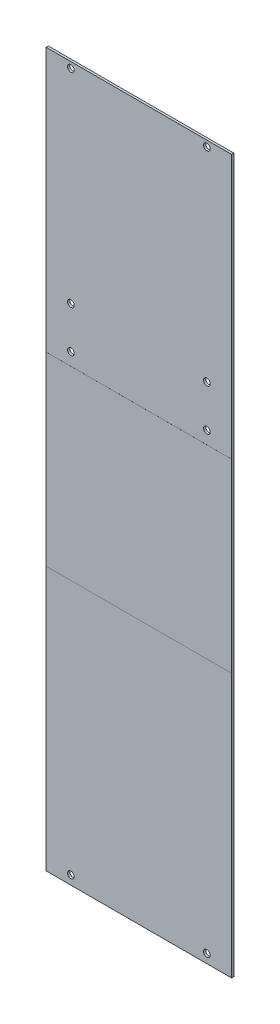
ISO-10303-21;
HEADER;
FILE_DESCRIPTION(('STEP AP214'),'2;1');
FILE_NAME('part.step','',(''),(''),'','','');
FILE_SCHEMA(('AUTOMOTIVE_DESIGN { 1 0 10303 214 1 1 1 1 }'));
ENDSEC;
DATA;
#1=APPLICATION_CONTEXT('core data for automotive mechanical design processes');
#2=APPLICATION_PROTOCOL_DEFINITION('international standard','automotive_design',2000,#1);
#3=PRODUCT_CONTEXT('',#1,'mechanical');
#4=PRODUCT('Part','Part','',(#3));
#5=PRODUCT_RELATED_PRODUCT_CATEGORY('part','',(#4));
#6=PRODUCT_DEFINITION_FORMATION('','',#4);
#7=PRODUCT_DEFINITION_CONTEXT('part definition',#1,'design');
#8=PRODUCT_DEFINITION('design','',#6,#7);
#9=PRODUCT_DEFINITION_SHAPE('','',#8);
#10=(LENGTH_UNIT() NAMED_UNIT(*) SI_UNIT(.MILLI.,.METRE.));
#11=(NAMED_UNIT(*) PLANE_ANGLE_UNIT() SI_UNIT($,.RADIAN.));
#12=(NAMED_UNIT(*) SI_UNIT($,.STERADIAN.) SOLID_ANGLE_UNIT());
#13=UNCERTAINTY_MEASURE_WITH_UNIT(LENGTH_MEASURE(1.E-05),#10,'distance_accuracy_value','');
#14=(GEOMETRIC_REPRESENTATION_CONTEXT(3) GLOBAL_UNCERTAINTY_ASSIGNED_CONTEXT((#13)) GLOBAL_UNIT_ASSIGNED_CONTEXT((#10,
#11,#12)) REPRESENTATION_CONTEXT('',''));
#15=CARTESIAN_POINT('',(0.,0.,0.));
#16=DIRECTION('',(0.,0.,1.));
#17=DIRECTION('',(1.,0.,0.));
#18=AXIS2_PLACEMENT_3D('',#15,#16,#17);
#19=CARTESIAN_POINT('',(0.,0.,1.));
#20=DIRECTION('',(0.,0.,1.));
#21=DIRECTION('',(1.,0.,0.));
#22=AXIS2_PLACEMENT_3D('',#19,#20,#21);
#23=PLANE('',#22);
#24=DIRECTION('',(1.,0.,0.));
#25=VECTOR('',#24,1.);
#26=CARTESIAN_POINT('',(-41.6,-41.6,1.));
#27=LINE('',#26,#25);
#28=CARTESIAN_POINT('',(-41.6,-41.6,1.));
#29=VERTEX_POINT('',#28);
#30=CARTESIAN_POINT('',(41.6,-41.6,1.));
#31=VERTEX_POINT('',#30);
#32=EDGE_CURVE('E123',#29,#31,#27,.T.);
#33=ORIENTED_EDGE('',*,*,#32,.F.);
#34=DIRECTION('',(0.,-1.,0.));
#35=VECTOR('',#34,1.);
#36=CARTESIAN_POINT('',(-41.6,-160.,1.));
#37=LINE('',#36,#35);
#38=CARTESIAN_POINT('',(-41.6,-160.,1.));
#39=VERTEX_POINT('',#38);
#40=EDGE_CURVE('E185',#29,#39,#37,.T.);
#41=ORIENTED_EDGE('',*,*,#40,.T.);
#42=DIRECTION('',(1.,0.,0.));
#43=VECTOR('',#42,1.);
#44=CARTESIAN_POINT('',(41.6,-160.,1.));
#45=LINE('',#44,#43);
#46=CARTESIAN_POINT('',(41.6,-160.,1.));
#47=VERTEX_POINT('',#46);
#48=EDGE_CURVE('E184',#39,#47,#45,.T.);
#49=ORIENTED_EDGE('',*,*,#48,.T.);
#50=DIRECTION('',(0.,1.,0.));
#51=VECTOR('',#50,1.);
#52=CARTESIAN_POINT('',(41.6,-160.,1.));
#53=LINE('',#52,#51);
#54=EDGE_CURVE('E62',#47,#31,#53,.T.);
#55=ORIENTED_EDGE('',*,*,#54,.T.);
#56=EDGE_LOOP('',(#33,#41,#49,#55));
#57=FACE_BOUND('',#56,.T.);
#58=CARTESIAN_POINT('',(-30.5,-156.,1.));
#59=DIRECTION('',(0.,0.,1.));
#60=DIRECTION('',(1.,0.,0.));
#61=AXIS2_PLACEMENT_3D('',#58,#59,#60);
#62=CIRCLE('',#61,1.5);
#63=CARTESIAN_POINT('',(-29.,-156.,1.));
#64=VERTEX_POINT('',#63);
#65=EDGE_CURVE('E151',#64,#64,#62,.T.);
#66=ORIENTED_EDGE('',*,*,#65,.F.);
#67=EDGE_LOOP('',(#66));
#68=FACE_BOUND('',#67,.T.);
#69=CARTESIAN_POINT('',(30.5,-156.,1.));
#70=DIRECTION('',(0.,0.,1.));
#71=DIRECTION('',(1.,0.,0.));
#72=AXIS2_PLACEMENT_3D('',#69,#70,#71);
#73=CIRCLE('',#72,1.5);
#74=CARTESIAN_POINT('',(32.,-156.,1.));
#75=VERTEX_POINT('',#74);
#76=EDGE_CURVE('E145',#75,#75,#73,.T.);
#77=ORIENTED_EDGE('',*,*,#76,.F.);
#78=EDGE_LOOP('',(#77));
#79=FACE_BOUND('',#78,.T.);
#80=ADVANCED_FACE('F39',(#57,#68,#79),#23,.T.);
#81=CARTESIAN_POINT('',(-41.6,-160.,1.));
#82=DIRECTION('',(1.,0.,0.));
#83=DIRECTION('',(0.,0.,-1.));
#84=AXIS2_PLACEMENT_3D('',#81,#82,#83);
#85=PLANE('',#84);
#86=DIRECTION('',(0.,-1.,0.));
#87=VECTOR('',#86,1.);
#88=CARTESIAN_POINT('',(-41.6,-160.,0.));
#89=LINE('',#88,#87);
#90=CARTESIAN_POINT('',(-41.6,160.,0.));
#91=VERTEX_POINT('',#90);
#92=CARTESIAN_POINT('',(-41.6,-160.,0.));
#93=VERTEX_POINT('',#92);
#94=EDGE_CURVE('E181',#91,#93,#89,.T.);
#95=ORIENTED_EDGE('',*,*,#94,.T.);
#96=DIRECTION('',(0.,0.,-1.));
#97=VECTOR('',#96,1.);
#98=CARTESIAN_POINT('',(-41.6,-160.,1.));
#99=LINE('',#98,#97);
#100=EDGE_CURVE('E11',#39,#93,#99,.T.);
#101=ORIENTED_EDGE('',*,*,#100,.F.);
#102=ORIENTED_EDGE('',*,*,#40,.F.);
#103=DIRECTION('',(0.,0.,-1.));
#104=VECTOR('',#103,1.);
#105=CARTESIAN_POINT('',(-41.6,-41.6,1.01));
#106=LINE('',#105,#104);
#107=CARTESIAN_POINT('',(-41.6,-41.6,1.01));
#108=VERTEX_POINT('',#107);
#109=EDGE_CURVE('E133',#108,#29,#106,.T.);
#110=ORIENTED_EDGE('',*,*,#109,.F.);
#111=DIRECTION('',(0.,-1.,0.));
#112=VECTOR('',#111,1.);
#113=CARTESIAN_POINT('',(-41.6,-41.6,1.01));
#114=LINE('',#113,#112);
#115=CARTESIAN_POINT('',(-41.6,41.6,1.01));
#116=VERTEX_POINT('',#115);
#117=EDGE_CURVE('E113',#116,#108,#114,.T.);
#118=ORIENTED_EDGE('',*,*,#117,.F.);
#119=DIRECTION('',(0.,0.,-1.));
#120=VECTOR('',#119,1.);
#121=CARTESIAN_POINT('',(-41.6,41.6,1.01));
#122=LINE('',#121,#120);
#123=CARTESIAN_POINT('',(-41.6,41.6,1.));
#124=VERTEX_POINT('',#123);
#125=EDGE_CURVE('E110',#116,#124,#122,.T.);
#126=ORIENTED_EDGE('',*,*,#125,.T.);
#127=CARTESIAN_POINT('',(-41.6,160.,1.));
#128=VERTEX_POINT('',#127);
#129=EDGE_CURVE('E182',#128,#124,#37,.T.);
#130=ORIENTED_EDGE('',*,*,#129,.F.);
#131=DIRECTION('',(0.,0.,-1.));
#132=VECTOR('',#131,1.);
#133=CARTESIAN_POINT('',(-41.6,160.,1.));
#134=LINE('',#133,#132);
#135=EDGE_CURVE('E190',#128,#91,#134,.T.);
#136=ORIENTED_EDGE('',*,*,#135,.T.);
#137=EDGE_LOOP('',(#95,#101,#102,#110,#118,#126,#130,#136));
#138=FACE_BOUND('',#137,.T.);
#139=ADVANCED_FACE('F41',(#138),#85,.F.);
#140=CARTESIAN_POINT('',(41.6,-160.,1.));
#141=DIRECTION('',(0.,1.,0.));
#142=DIRECTION('',(-1.,0.,0.));
#143=AXIS2_PLACEMENT_3D('',#140,#141,#142);
#144=PLANE('',#143);
#145=DIRECTION('',(1.,0.,0.));
#146=VECTOR('',#145,1.);
#147=CARTESIAN_POINT('',(41.6,-160.,0.));
#148=LINE('',#147,#146);
#149=CARTESIAN_POINT('',(41.6,-160.,0.));
#150=VERTEX_POINT('',#149);
#151=EDGE_CURVE('E193',#93,#150,#148,.T.);
#152=ORIENTED_EDGE('',*,*,#151,.T.);
#153=DIRECTION('',(0.,0.,-1.));
#154=VECTOR('',#153,1.);
#155=CARTESIAN_POINT('',(41.6,-160.,1.));
#156=LINE('',#155,#154);
#157=EDGE_CURVE('E47',#47,#150,#156,.T.);
#158=ORIENTED_EDGE('',*,*,#157,.F.);
#159=ORIENTED_EDGE('',*,*,#48,.F.);
#160=ORIENTED_EDGE('',*,*,#100,.T.);
#161=EDGE_LOOP('',(#152,#158,#159,#160));
#162=FACE_BOUND('',#161,.T.);
#163=ADVANCED_FACE('F233',(#162),#144,.F.);
#164=CARTESIAN_POINT('',(41.6,-160.,1.));
#165=DIRECTION('',(-1.,0.,0.));
#166=DIRECTION('',(0.,0.,1.));
#167=AXIS2_PLACEMENT_3D('',#164,#165,#166);
#168=PLANE('',#167);
#169=DIRECTION('',(0.,1.,0.));
#170=VECTOR('',#169,1.);
#171=CARTESIAN_POINT('',(41.6,-160.,0.));
#172=LINE('',#171,#170);
#173=CARTESIAN_POINT('',(41.6,160.,0.));
#174=VERTEX_POINT('',#173);
#175=EDGE_CURVE('E195',#150,#174,#172,.T.);
#176=ORIENTED_EDGE('',*,*,#175,.T.);
#177=DIRECTION('',(0.,0.,-1.));
#178=VECTOR('',#177,1.);
#179=CARTESIAN_POINT('',(41.6,160.,1.));
#180=LINE('',#179,#178);
#181=CARTESIAN_POINT('',(41.6,160.,1.));
#182=VERTEX_POINT('',#181);
#183=EDGE_CURVE('E201',#182,#174,#180,.T.);
#184=ORIENTED_EDGE('',*,*,#183,.F.);
#185=CARTESIAN_POINT('',(41.6,41.6,1.));
#186=VERTEX_POINT('',#185);
#187=EDGE_CURVE('E127',#186,#182,#53,.T.);
#188=ORIENTED_EDGE('',*,*,#187,.F.);
#189=DIRECTION('',(0.,0.,-1.));
#190=VECTOR('',#189,1.);
#191=CARTESIAN_POINT('',(41.6,41.6,1.01));
#192=LINE('',#191,#190);
#193=CARTESIAN_POINT('',(41.6,41.6,1.01));
#194=VERTEX_POINT('',#193);
#195=EDGE_CURVE('E108',#194,#186,#192,.T.);
#196=ORIENTED_EDGE('',*,*,#195,.F.);
#197=DIRECTION('',(0.,1.,0.));
#198=VECTOR('',#197,1.);
#199=CARTESIAN_POINT('',(41.6,-41.6,1.01));
#200=LINE('',#199,#198);
#201=CARTESIAN_POINT('',(41.6,-41.6,1.01));
#202=VERTEX_POINT('',#201);
#203=EDGE_CURVE('E114',#202,#194,#200,.T.);
#204=ORIENTED_EDGE('',*,*,#203,.F.);
#205=DIRECTION('',(0.,0.,-1.));
#206=VECTOR('',#205,1.);
#207=CARTESIAN_POINT('',(41.6,-41.6,1.01));
#208=LINE('',#207,#206);
#209=EDGE_CURVE('E226',#202,#31,#208,.T.);
#210=ORIENTED_EDGE('',*,*,#209,.T.);
#211=ORIENTED_EDGE('',*,*,#54,.F.);
#212=ORIENTED_EDGE('',*,*,#157,.T.);
#213=EDGE_LOOP('',(#176,#184,#188,#196,#204,#210,#211,#212));
#214=FACE_BOUND('',#213,.T.);
#215=ADVANCED_FACE('F125',(#214),#168,.F.);
#216=CARTESIAN_POINT('',(41.6,160.,1.));
#217=DIRECTION('',(0.,-1.,0.));
#218=DIRECTION('',(0.,0.,-1.));
#219=AXIS2_PLACEMENT_3D('',#216,#217,#218);
#220=PLANE('',#219);
#221=DIRECTION('',(-1.,0.,0.));
#222=VECTOR('',#221,1.);
#223=CARTESIAN_POINT('',(41.6,160.,0.));
#224=LINE('',#223,#222);
#225=EDGE_CURVE('E197',#174,#91,#224,.T.);
#226=ORIENTED_EDGE('',*,*,#225,.T.);
#227=ORIENTED_EDGE('',*,*,#135,.F.);
#228=DIRECTION('',(-1.,0.,0.));
#229=VECTOR('',#228,1.);
#230=CARTESIAN_POINT('',(41.6,160.,1.));
#231=LINE('',#230,#229);
#232=EDGE_CURVE('E188',#182,#128,#231,.T.);
#233=ORIENTED_EDGE('',*,*,#232,.F.);
#234=ORIENTED_EDGE('',*,*,#183,.T.);
#235=EDGE_LOOP('',(#226,#227,#233,#234));
#236=FACE_BOUND('',#235,.T.);
#237=ADVANCED_FACE('F214',(#236),#220,.F.);
#238=DIRECTION('',(-1.,0.,0.));
#239=VECTOR('',#238,1.);
#240=CARTESIAN_POINT('',(-41.6,41.6,1.));
#241=LINE('',#240,#239);
#242=EDGE_CURVE('E54',#186,#124,#241,.T.);
#243=ORIENTED_EDGE('',*,*,#242,.F.);
#244=ORIENTED_EDGE('',*,*,#187,.T.);
#245=ORIENTED_EDGE('',*,*,#232,.T.);
#246=ORIENTED_EDGE('',*,*,#129,.T.);
#247=EDGE_LOOP('',(#243,#244,#245,#246));
#248=FACE_BOUND('',#247,.T.);
#249=CARTESIAN_POINT('',(-30.5,65.9999999999997,1.));
#250=DIRECTION('',(0.,0.,1.));
#251=DIRECTION('',(1.,0.,0.));
#252=AXIS2_PLACEMENT_3D('',#249,#250,#251);
#253=CIRCLE('',#252,1.5);
#254=CARTESIAN_POINT('',(-29.,65.9999999999997,1.));
#255=VERTEX_POINT('',#254);
#256=EDGE_CURVE('E128',#255,#255,#253,.T.);
#257=ORIENTED_EDGE('',*,*,#256,.F.);
#258=EDGE_LOOP('',(#257));
#259=FACE_BOUND('',#258,.T.);
#260=CARTESIAN_POINT('',(30.5,65.9999999999994,1.));
#261=DIRECTION('',(0.,0.,1.));
#262=DIRECTION('',(1.,0.,0.));
#263=AXIS2_PLACEMENT_3D('',#260,#261,#262);
#264=CIRCLE('',#263,1.5);
#265=CARTESIAN_POINT('',(32.,65.9999999999994,1.));
#266=VERTEX_POINT('',#265);
#267=EDGE_CURVE('E139',#266,#266,#264,.T.);
#268=ORIENTED_EDGE('',*,*,#267,.F.);
#269=EDGE_LOOP('',(#268));
#270=FACE_BOUND('',#269,.T.);
#271=CARTESIAN_POINT('',(-30.5,157.3,1.));
#272=DIRECTION('',(0.,0.,1.));
#273=DIRECTION('',(1.,0.,0.));
#274=AXIS2_PLACEMENT_3D('',#271,#272,#273);
#275=CIRCLE('',#274,1.5);
#276=CARTESIAN_POINT('',(-29.,157.3,1.));
#277=VERTEX_POINT('',#276);
#278=EDGE_CURVE('E157',#277,#277,#275,.T.);
#279=ORIENTED_EDGE('',*,*,#278,.F.);
#280=EDGE_LOOP('',(#279));
#281=FACE_BOUND('',#280,.T.);
#282=CARTESIAN_POINT('',(30.5,157.3,1.));
#283=DIRECTION('',(0.,0.,1.));
#284=DIRECTION('',(1.,0.,0.));
#285=AXIS2_PLACEMENT_3D('',#282,#283,#284);
#286=CIRCLE('',#285,1.5);
#287=CARTESIAN_POINT('',(32.,157.3,1.));
#288=VERTEX_POINT('',#287);
#289=EDGE_CURVE('E163',#288,#288,#286,.T.);
#290=ORIENTED_EDGE('',*,*,#289,.F.);
#291=EDGE_LOOP('',(#290));
#292=FACE_BOUND('',#291,.T.);
#293=CARTESIAN_POINT('',(-30.5000000000001,47.3,1.));
#294=DIRECTION('',(0.,0.,1.));
#295=DIRECTION('',(1.,0.,0.));
#296=AXIS2_PLACEMENT_3D('',#293,#294,#295);
#297=CIRCLE('',#296,1.5);
#298=CARTESIAN_POINT('',(-29.0000000000001,47.3,1.));
#299=VERTEX_POINT('',#298);
#300=EDGE_CURVE('E169',#299,#299,#297,.T.);
#301=ORIENTED_EDGE('',*,*,#300,.F.);
#302=EDGE_LOOP('',(#301));
#303=FACE_BOUND('',#302,.T.);
#304=CARTESIAN_POINT('',(30.5,47.3000000000001,1.));
#305=DIRECTION('',(0.,0.,1.));
#306=DIRECTION('',(1.,0.,0.));
#307=AXIS2_PLACEMENT_3D('',#304,#305,#306);
#308=CIRCLE('',#307,1.5);
#309=CARTESIAN_POINT('',(32.,47.3000000000001,1.));
#310=VERTEX_POINT('',#309);
#311=EDGE_CURVE('E175',#310,#310,#308,.T.);
#312=ORIENTED_EDGE('',*,*,#311,.F.);
#313=EDGE_LOOP('',(#312));
#314=FACE_BOUND('',#313,.T.);
#315=ADVANCED_FACE('F219',(#248,#259,#270,#281,#292,#303,#314),#23,.T.);
#316=CARTESIAN_POINT('',(0.,0.,0.));
#317=DIRECTION('',(0.,0.,1.));
#318=DIRECTION('',(1.,0.,0.));
#319=AXIS2_PLACEMENT_3D('',#316,#317,#318);
#320=PLANE('',#319);
#321=CARTESIAN_POINT('',(-30.5,65.9999999999997,0.));
#322=DIRECTION('',(0.,0.,1.));
#323=DIRECTION('',(1.,0.,0.));
#324=AXIS2_PLACEMENT_3D('',#321,#322,#323);
#325=CIRCLE('',#324,1.5);
#326=CARTESIAN_POINT('',(-29.,65.9999999999997,0.));
#327=VERTEX_POINT('',#326);
#328=EDGE_CURVE('E131',#327,#327,#325,.T.);
#329=ORIENTED_EDGE('',*,*,#328,.T.);
#330=EDGE_LOOP('',(#329));
#331=FACE_BOUND('',#330,.T.);
#332=CARTESIAN_POINT('',(30.5,65.9999999999994,0.));
#333=DIRECTION('',(0.,0.,1.));
#334=DIRECTION('',(1.,0.,0.));
#335=AXIS2_PLACEMENT_3D('',#332,#333,#334);
#336=CIRCLE('',#335,1.5);
#337=CARTESIAN_POINT('',(32.,65.9999999999994,0.));
#338=VERTEX_POINT('',#337);
#339=EDGE_CURVE('E142',#338,#338,#336,.T.);
#340=ORIENTED_EDGE('',*,*,#339,.T.);
#341=EDGE_LOOP('',(#340));
#342=FACE_BOUND('',#341,.T.);
#343=CARTESIAN_POINT('',(30.5,-156.,0.));
#344=DIRECTION('',(0.,0.,1.));
#345=DIRECTION('',(1.,0.,0.));
#346=AXIS2_PLACEMENT_3D('',#343,#344,#345);
#347=CIRCLE('',#346,1.5);
#348=CARTESIAN_POINT('',(32.,-156.,0.));
#349=VERTEX_POINT('',#348);
#350=EDGE_CURVE('E148',#349,#349,#347,.T.);
#351=ORIENTED_EDGE('',*,*,#350,.T.);
#352=EDGE_LOOP('',(#351));
#353=FACE_BOUND('',#352,.T.);
#354=CARTESIAN_POINT('',(-30.5,-156.,0.));
#355=DIRECTION('',(0.,0.,1.));
#356=DIRECTION('',(1.,0.,0.));
#357=AXIS2_PLACEMENT_3D('',#354,#355,#356);
#358=CIRCLE('',#357,1.5);
#359=CARTESIAN_POINT('',(-29.,-156.,0.));
#360=VERTEX_POINT('',#359);
#361=EDGE_CURVE('E154',#360,#360,#358,.T.);
#362=ORIENTED_EDGE('',*,*,#361,.T.);
#363=EDGE_LOOP('',(#362));
#364=FACE_BOUND('',#363,.T.);
#365=CARTESIAN_POINT('',(-30.5,157.3,0.));
#366=DIRECTION('',(0.,0.,1.));
#367=DIRECTION('',(1.,0.,0.));
#368=AXIS2_PLACEMENT_3D('',#365,#366,#367);
#369=CIRCLE('',#368,1.5);
#370=CARTESIAN_POINT('',(-29.,157.3,0.));
#371=VERTEX_POINT('',#370);
#372=EDGE_CURVE('E160',#371,#371,#369,.T.);
#373=ORIENTED_EDGE('',*,*,#372,.T.);
#374=EDGE_LOOP('',(#373));
#375=FACE_BOUND('',#374,.T.);
#376=CARTESIAN_POINT('',(30.5,157.3,0.));
#377=DIRECTION('',(0.,0.,1.));
#378=DIRECTION('',(1.,0.,0.));
#379=AXIS2_PLACEMENT_3D('',#376,#377,#378);
#380=CIRCLE('',#379,1.5);
#381=CARTESIAN_POINT('',(32.,157.3,0.));
#382=VERTEX_POINT('',#381);
#383=EDGE_CURVE('E166',#382,#382,#380,.T.);
#384=ORIENTED_EDGE('',*,*,#383,.T.);
#385=EDGE_LOOP('',(#384));
#386=FACE_BOUND('',#385,.T.);
#387=CARTESIAN_POINT('',(-30.5000000000001,47.3,0.));
#388=DIRECTION('',(0.,0.,1.));
#389=DIRECTION('',(1.,0.,0.));
#390=AXIS2_PLACEMENT_3D('',#387,#388,#389);
#391=CIRCLE('',#390,1.5);
#392=CARTESIAN_POINT('',(-29.0000000000001,47.3,0.));
#393=VERTEX_POINT('',#392);
#394=EDGE_CURVE('E172',#393,#393,#391,.T.);
#395=ORIENTED_EDGE('',*,*,#394,.T.);
#396=EDGE_LOOP('',(#395));
#397=FACE_BOUND('',#396,.T.);
#398=CARTESIAN_POINT('',(30.5,47.3000000000001,0.));
#399=DIRECTION('',(0.,0.,1.));
#400=DIRECTION('',(1.,0.,0.));
#401=AXIS2_PLACEMENT_3D('',#398,#399,#400);
#402=CIRCLE('',#401,1.5);
#403=CARTESIAN_POINT('',(32.,47.3000000000001,0.));
#404=VERTEX_POINT('',#403);
#405=EDGE_CURVE('E178',#404,#404,#402,.T.);
#406=ORIENTED_EDGE('',*,*,#405,.T.);
#407=EDGE_LOOP('',(#406));
#408=FACE_BOUND('',#407,.T.);
#409=ORIENTED_EDGE('',*,*,#94,.F.);
#410=ORIENTED_EDGE('',*,*,#225,.F.);
#411=ORIENTED_EDGE('',*,*,#175,.F.);
#412=ORIENTED_EDGE('',*,*,#151,.F.);
#413=EDGE_LOOP('',(#409,#410,#411,#412));
#414=FACE_BOUND('',#413,.T.);
#415=ADVANCED_FACE('F211',(#331,#342,#353,#364,#375,#386,#397,#408,#414),#320,.F.);
#416=CARTESIAN_POINT('',(30.5,47.3000000000001,1.));
#417=DIRECTION('',(0.,0.,1.));
#418=DIRECTION('',(1.,0.,0.));
#419=AXIS2_PLACEMENT_3D('',#416,#417,#418);
#420=CYLINDRICAL_SURFACE('',#419,1.5);
#421=ORIENTED_EDGE('',*,*,#405,.F.);
#422=EDGE_LOOP('',(#421));
#423=FACE_BOUND('',#422,.T.);
#424=ORIENTED_EDGE('',*,*,#311,.T.);
#425=EDGE_LOOP('',(#424));
#426=FACE_BOUND('',#425,.T.);
#427=ADVANCED_FACE('F251',(#423,#426),#420,.F.);
#428=CARTESIAN_POINT('',(-30.5000000000001,47.3,1.));
#429=DIRECTION('',(0.,0.,1.));
#430=DIRECTION('',(1.,0.,0.));
#431=AXIS2_PLACEMENT_3D('',#428,#429,#430);
#432=CYLINDRICAL_SURFACE('',#431,1.5);
#433=ORIENTED_EDGE('',*,*,#394,.F.);
#434=EDGE_LOOP('',(#433));
#435=FACE_BOUND('',#434,.T.);
#436=ORIENTED_EDGE('',*,*,#300,.T.);
#437=EDGE_LOOP('',(#436));
#438=FACE_BOUND('',#437,.T.);
#439=ADVANCED_FACE('F324',(#435,#438),#432,.F.);
#440=CARTESIAN_POINT('',(30.5,157.3,1.));
#441=DIRECTION('',(0.,0.,1.));
#442=DIRECTION('',(1.,0.,0.));
#443=AXIS2_PLACEMENT_3D('',#440,#441,#442);
#444=CYLINDRICAL_SURFACE('',#443,1.5);
#445=ORIENTED_EDGE('',*,*,#383,.F.);
#446=EDGE_LOOP('',(#445));
#447=FACE_BOUND('',#446,.T.);
#448=ORIENTED_EDGE('',*,*,#289,.T.);
#449=EDGE_LOOP('',(#448));
#450=FACE_BOUND('',#449,.T.);
#451=ADVANCED_FACE('F320',(#447,#450),#444,.F.);
#452=CARTESIAN_POINT('',(-30.5,157.3,1.));
#453=DIRECTION('',(0.,0.,1.));
#454=DIRECTION('',(1.,0.,0.));
#455=AXIS2_PLACEMENT_3D('',#452,#453,#454);
#456=CYLINDRICAL_SURFACE('',#455,1.5);
#457=ORIENTED_EDGE('',*,*,#372,.F.);
#458=EDGE_LOOP('',(#457));
#459=FACE_BOUND('',#458,.T.);
#460=ORIENTED_EDGE('',*,*,#278,.T.);
#461=EDGE_LOOP('',(#460));
#462=FACE_BOUND('',#461,.T.);
#463=ADVANCED_FACE('F316',(#459,#462),#456,.F.);
#464=CARTESIAN_POINT('',(-30.5,-156.,1.));
#465=DIRECTION('',(0.,0.,1.));
#466=DIRECTION('',(1.,0.,0.));
#467=AXIS2_PLACEMENT_3D('',#464,#465,#466);
#468=CYLINDRICAL_SURFACE('',#467,1.5);
#469=ORIENTED_EDGE('',*,*,#361,.F.);
#470=EDGE_LOOP('',(#469));
#471=FACE_BOUND('',#470,.T.);
#472=ORIENTED_EDGE('',*,*,#65,.T.);
#473=EDGE_LOOP('',(#472));
#474=FACE_BOUND('',#473,.T.);
#475=ADVANCED_FACE('F312',(#471,#474),#468,.F.);
#476=CARTESIAN_POINT('',(30.5,-156.,1.));
#477=DIRECTION('',(0.,0.,1.));
#478=DIRECTION('',(1.,0.,0.));
#479=AXIS2_PLACEMENT_3D('',#476,#477,#478);
#480=CYLINDRICAL_SURFACE('',#479,1.5);
#481=ORIENTED_EDGE('',*,*,#350,.F.);
#482=EDGE_LOOP('',(#481));
#483=FACE_BOUND('',#482,.T.);
#484=ORIENTED_EDGE('',*,*,#76,.T.);
#485=EDGE_LOOP('',(#484));
#486=FACE_BOUND('',#485,.T.);
#487=ADVANCED_FACE('F308',(#483,#486),#480,.F.);
#488=CARTESIAN_POINT('',(30.5,65.9999999999994,1.));
#489=DIRECTION('',(0.,0.,1.));
#490=DIRECTION('',(1.,0.,0.));
#491=AXIS2_PLACEMENT_3D('',#488,#489,#490);
#492=CYLINDRICAL_SURFACE('',#491,1.5);
#493=ORIENTED_EDGE('',*,*,#339,.F.);
#494=EDGE_LOOP('',(#493));
#495=FACE_BOUND('',#494,.T.);
#496=ORIENTED_EDGE('',*,*,#267,.T.);
#497=EDGE_LOOP('',(#496));
#498=FACE_BOUND('',#497,.T.);
#499=ADVANCED_FACE('F304',(#495,#498),#492,.F.);
#500=CARTESIAN_POINT('',(-30.5,65.9999999999997,1.));
#501=DIRECTION('',(0.,0.,1.));
#502=DIRECTION('',(1.,0.,0.));
#503=AXIS2_PLACEMENT_3D('',#500,#501,#502);
#504=CYLINDRICAL_SURFACE('',#503,1.5);
#505=ORIENTED_EDGE('',*,*,#328,.F.);
#506=EDGE_LOOP('',(#505));
#507=FACE_BOUND('',#506,.T.);
#508=ORIENTED_EDGE('',*,*,#256,.T.);
#509=EDGE_LOOP('',(#508));
#510=FACE_BOUND('',#509,.T.);
#511=ADVANCED_FACE('F279',(#507,#510),#504,.F.);
#512=CARTESIAN_POINT('',(-41.6,41.6,1.01));
#513=DIRECTION('',(0.,-1.,0.));
#514=DIRECTION('',(0.,0.,-1.));
#515=AXIS2_PLACEMENT_3D('',#512,#513,#514);
#516=PLANE('',#515);
#517=ORIENTED_EDGE('',*,*,#242,.T.);
#518=ORIENTED_EDGE('',*,*,#125,.F.);
#519=DIRECTION('',(-1.,0.,0.));
#520=VECTOR('',#519,1.);
#521=CARTESIAN_POINT('',(-41.6,41.6,1.01));
#522=LINE('',#521,#520);
#523=EDGE_CURVE('E104',#194,#116,#522,.T.);
#524=ORIENTED_EDGE('',*,*,#523,.F.);
#525=ORIENTED_EDGE('',*,*,#195,.T.);
#526=EDGE_LOOP('',(#517,#518,#524,#525));
#527=FACE_BOUND('',#526,.T.);
#528=ADVANCED_FACE('F106',(#527),#516,.F.);
#529=CARTESIAN_POINT('',(-41.6,-41.6,1.01));
#530=DIRECTION('',(0.,1.,0.));
#531=DIRECTION('',(0.,0.,1.));
#532=AXIS2_PLACEMENT_3D('',#529,#530,#531);
#533=PLANE('',#532);
#534=ORIENTED_EDGE('',*,*,#32,.T.);
#535=ORIENTED_EDGE('',*,*,#209,.F.);
#536=DIRECTION('',(1.,0.,0.));
#537=VECTOR('',#536,1.);
#538=CARTESIAN_POINT('',(-41.6,-41.6,1.01));
#539=LINE('',#538,#537);
#540=EDGE_CURVE('E119',#108,#202,#539,.T.);
#541=ORIENTED_EDGE('',*,*,#540,.F.);
#542=ORIENTED_EDGE('',*,*,#109,.T.);
#543=EDGE_LOOP('',(#534,#535,#541,#542));
#544=FACE_BOUND('',#543,.T.);
#545=ADVANCED_FACE('F230',(#544),#533,.F.);
#546=CARTESIAN_POINT('',(0.,0.,1.01));
#547=DIRECTION('',(0.,0.,-1.));
#548=DIRECTION('',(-1.,0.,0.));
#549=AXIS2_PLACEMENT_3D('',#546,#547,#548);
#550=PLANE('',#549);
#551=ORIENTED_EDGE('',*,*,#203,.T.);
#552=ORIENTED_EDGE('',*,*,#523,.T.);
#553=ORIENTED_EDGE('',*,*,#117,.T.);
#554=ORIENTED_EDGE('',*,*,#540,.T.);
#555=EDGE_LOOP('',(#551,#552,#553,#554));
#556=FACE_BOUND('',#555,.T.);
#557=ADVANCED_FACE('F117',(#556),#550,.F.);
#558=CLOSED_SHELL('',(#80,#139,#163,#215,#237,#315,#415,#427,#439,#451,#463,#475,#487,#499,#511,
#528,#545,#557));
#559=MANIFOLD_SOLID_BREP('B2',#558);
#560=ADVANCED_BREP_SHAPE_REPRESENTATION('',(#18,#559),#14);
#561=SHAPE_DEFINITION_REPRESENTATION(#9,#560);
ENDSEC;
END-ISO-10303-21;
